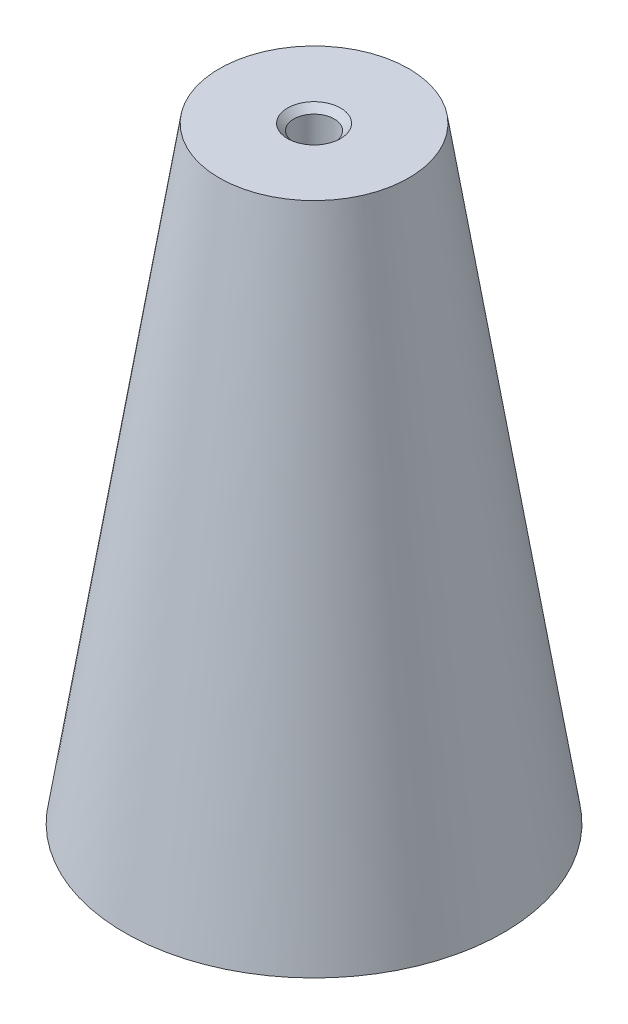
ISO-10303-21;
HEADER;
FILE_DESCRIPTION(('STEP AP214'),'2;1');
FILE_NAME('part.step','',(''),(''),'','','');
FILE_SCHEMA(('AUTOMOTIVE_DESIGN { 1 0 10303 214 1 1 1 1 }'));
ENDSEC;
DATA;
#1=APPLICATION_CONTEXT('core data for automotive mechanical design processes');
#2=APPLICATION_PROTOCOL_DEFINITION('international standard','automotive_design',2000,#1);
#3=PRODUCT_CONTEXT('',#1,'mechanical');
#4=PRODUCT('Part','Part','',(#3));
#5=PRODUCT_RELATED_PRODUCT_CATEGORY('part','',(#4));
#6=PRODUCT_DEFINITION_FORMATION('','',#4);
#7=PRODUCT_DEFINITION_CONTEXT('part definition',#1,'design');
#8=PRODUCT_DEFINITION('design','',#6,#7);
#9=PRODUCT_DEFINITION_SHAPE('','',#8);
#10=(LENGTH_UNIT() NAMED_UNIT(*) SI_UNIT(.MILLI.,.METRE.));
#11=(NAMED_UNIT(*) PLANE_ANGLE_UNIT() SI_UNIT($,.RADIAN.));
#12=(NAMED_UNIT(*) SI_UNIT($,.STERADIAN.) SOLID_ANGLE_UNIT());
#13=UNCERTAINTY_MEASURE_WITH_UNIT(LENGTH_MEASURE(1.E-05),#10,'distance_accuracy_value','');
#14=(GEOMETRIC_REPRESENTATION_CONTEXT(3) GLOBAL_UNCERTAINTY_ASSIGNED_CONTEXT((#13)) GLOBAL_UNIT_ASSIGNED_CONTEXT((#10,
#11,#12)) REPRESENTATION_CONTEXT('',''));
#15=CARTESIAN_POINT('',(0.,0.,0.));
#16=DIRECTION('',(0.,0.,1.));
#17=DIRECTION('',(1.,0.,0.));
#18=AXIS2_PLACEMENT_3D('',#15,#16,#17);
#19=CARTESIAN_POINT('',(0.,0.,0.));
#20=DIRECTION('',(0.,-1.,0.));
#21=DIRECTION('',(0.,0.,-1.));
#22=AXIS2_PLACEMENT_3D('',#19,#20,#21);
#23=CONICAL_SURFACE('',#22,7.49999999999999,0.154996741923941);
#24=CARTESIAN_POINT('',(0.,-48.,0.));
#25=DIRECTION('',(0.,-1.,0.));
#26=DIRECTION('',(0.,0.,-1.));
#27=AXIS2_PLACEMENT_3D('',#24,#25,#26);
#28=CIRCLE('',#27,15.);
#29=CARTESIAN_POINT('',(0.,-48.,-15.));
#30=VERTEX_POINT('',#29);
#31=EDGE_CURVE('E65',#30,#30,#28,.T.);
#32=ORIENTED_EDGE('',*,*,#31,.F.);
#33=EDGE_LOOP('',(#32));
#34=FACE_BOUND('',#33,.T.);
#35=CARTESIAN_POINT('',(0.,0.,0.));
#36=DIRECTION('',(0.,-1.,0.));
#37=DIRECTION('',(0.,0.,-1.));
#38=AXIS2_PLACEMENT_3D('',#35,#36,#37);
#39=CIRCLE('',#38,7.49999999999999);
#40=CARTESIAN_POINT('',(0.,0.,-7.49999999999998));
#41=VERTEX_POINT('',#40);
#42=EDGE_CURVE('E56',#41,#41,#39,.T.);
#43=ORIENTED_EDGE('',*,*,#42,.T.);
#44=EDGE_LOOP('',(#43));
#45=FACE_BOUND('',#44,.T.);
#46=ADVANCED_FACE('F35',(#34,#45),#23,.T.);
#47=CARTESIAN_POINT('',(0.,0.,7.5));
#48=DIRECTION('',(0.,-1.,0.));
#49=DIRECTION('',(0.,0.,-1.));
#50=AXIS2_PLACEMENT_3D('',#47,#48,#49);
#51=PLANE('',#50);
#52=CARTESIAN_POINT('',(0.,0.,0.));
#53=DIRECTION('',(0.,-1.,0.));
#54=DIRECTION('',(0.,0.,-1.));
#55=AXIS2_PLACEMENT_3D('',#52,#53,#54);
#56=CIRCLE('',#55,2.09999999999998);
#57=CARTESIAN_POINT('',(0.,0.,-2.09999999999998));
#58=VERTEX_POINT('',#57);
#59=EDGE_CURVE('E43',#58,#58,#56,.T.);
#60=ORIENTED_EDGE('',*,*,#59,.T.);
#61=EDGE_LOOP('',(#60));
#62=FACE_BOUND('',#61,.T.);
#63=ORIENTED_EDGE('',*,*,#42,.F.);
#64=EDGE_LOOP('',(#63));
#65=FACE_BOUND('',#64,.T.);
#66=ADVANCED_FACE('F73',(#62,#65),#51,.F.);
#67=CARTESIAN_POINT('',(0.,-4.,0.));
#68=DIRECTION('',(0.,1.,0.));
#69=DIRECTION('',(0.,0.,1.));
#70=AXIS2_PLACEMENT_3D('',#67,#68,#69);
#71=PLANE('',#70);
#72=CARTESIAN_POINT('',(0.,-4.,0.));
#73=DIRECTION('',(0.,1.,0.));
#74=DIRECTION('',(0.,0.,1.));
#75=AXIS2_PLACEMENT_3D('',#72,#73,#74);
#76=CIRCLE('',#75,2.09999999999998);
#77=CARTESIAN_POINT('',(0.,-4.,2.09999999999998));
#78=VERTEX_POINT('',#77);
#79=EDGE_CURVE('E10',#78,#78,#76,.T.);
#80=ORIENTED_EDGE('',*,*,#79,.T.);
#81=EDGE_LOOP('',(#80));
#82=FACE_BOUND('',#81,.T.);
#83=CARTESIAN_POINT('',(0.,-4.,0.));
#84=DIRECTION('',(0.,-1.,0.));
#85=DIRECTION('',(0.,0.,-1.));
#86=AXIS2_PLACEMENT_3D('',#83,#84,#85);
#87=CIRCLE('',#86,4.12499999999999);
#88=CARTESIAN_POINT('',(0.,-4.,-4.12499999999998));
#89=VERTEX_POINT('',#88);
#90=EDGE_CURVE('E59',#89,#89,#87,.T.);
#91=ORIENTED_EDGE('',*,*,#90,.T.);
#92=EDGE_LOOP('',(#91));
#93=FACE_BOUND('',#92,.T.);
#94=ADVANCED_FACE('F78',(#82,#93),#71,.F.);
#95=CARTESIAN_POINT('',(0.,-48.,0.));
#96=DIRECTION('',(0.,-1.,0.));
#97=DIRECTION('',(0.,0.,-1.));
#98=AXIS2_PLACEMENT_3D('',#95,#96,#97);
#99=CONICAL_SURFACE('',#98,11.,0.154996741923941);
#100=ORIENTED_EDGE('',*,*,#90,.F.);
#101=EDGE_LOOP('',(#100));
#102=FACE_BOUND('',#101,.T.);
#103=CARTESIAN_POINT('',(0.,-48.,0.));
#104=DIRECTION('',(0.,-1.,0.));
#105=DIRECTION('',(0.,0.,-1.));
#106=AXIS2_PLACEMENT_3D('',#103,#104,#105);
#107=CIRCLE('',#106,11.);
#108=CARTESIAN_POINT('',(0.,-48.,-11.));
#109=VERTEX_POINT('',#108);
#110=EDGE_CURVE('E62',#109,#109,#107,.T.);
#111=ORIENTED_EDGE('',*,*,#110,.T.);
#112=EDGE_LOOP('',(#111));
#113=FACE_BOUND('',#112,.T.);
#114=ADVANCED_FACE('F83',(#102,#113),#99,.F.);
#115=CARTESIAN_POINT('',(0.,-48.,11.));
#116=DIRECTION('',(0.,1.,0.));
#117=DIRECTION('',(0.,0.,1.));
#118=AXIS2_PLACEMENT_3D('',#115,#116,#117);
#119=PLANE('',#118);
#120=ORIENTED_EDGE('',*,*,#110,.F.);
#121=EDGE_LOOP('',(#120));
#122=FACE_BOUND('',#121,.T.);
#123=ORIENTED_EDGE('',*,*,#31,.T.);
#124=EDGE_LOOP('',(#123));
#125=FACE_BOUND('',#124,.T.);
#126=ADVANCED_FACE('F69',(#122,#125),#119,.F.);
#127=CARTESIAN_POINT('',(0.,-10.,0.));
#128=DIRECTION('',(0.,1.,0.));
#129=DIRECTION('',(0.,0.,1.));
#130=AXIS2_PLACEMENT_3D('',#127,#128,#129);
#131=CYLINDRICAL_SURFACE('',#130,1.6);
#132=CARTESIAN_POINT('',(0.,-0.499999999999983,0.));
#133=DIRECTION('',(0.,-1.,0.));
#134=DIRECTION('',(0.,0.,-1.));
#135=AXIS2_PLACEMENT_3D('',#132,#133,#134);
#136=CIRCLE('',#135,1.6);
#137=CARTESIAN_POINT('',(0.,-0.499999999999984,-1.6));
#138=VERTEX_POINT('',#137);
#139=EDGE_CURVE('E47',#138,#138,#136,.F.);
#140=ORIENTED_EDGE('',*,*,#139,.T.);
#141=EDGE_LOOP('',(#140));
#142=FACE_BOUND('',#141,.T.);
#143=CARTESIAN_POINT('',(0.,-3.50000000000001,0.));
#144=DIRECTION('',(0.,1.,0.));
#145=DIRECTION('',(0.,0.,1.));
#146=AXIS2_PLACEMENT_3D('',#143,#144,#145);
#147=CIRCLE('',#146,1.6);
#148=CARTESIAN_POINT('',(0.,-3.50000000000001,1.6));
#149=VERTEX_POINT('',#148);
#150=EDGE_CURVE('E51',#149,#149,#147,.F.);
#151=ORIENTED_EDGE('',*,*,#150,.T.);
#152=EDGE_LOOP('',(#151));
#153=FACE_BOUND('',#152,.T.);
#154=ADVANCED_FACE('F91',(#142,#153),#131,.F.);
#155=CARTESIAN_POINT('',(0.,-0.499999999999983,0.));
#156=DIRECTION('',(0.,1.,0.));
#157=DIRECTION('',(0.,0.,1.));
#158=AXIS2_PLACEMENT_3D('',#155,#156,#157);
#159=CONICAL_SURFACE('',#158,1.6,0.785398163397448);
#160=ORIENTED_EDGE('',*,*,#59,.F.);
#161=EDGE_LOOP('',(#160));
#162=FACE_BOUND('',#161,.T.);
#163=ORIENTED_EDGE('',*,*,#139,.F.);
#164=EDGE_LOOP('',(#163));
#165=FACE_BOUND('',#164,.T.);
#166=ADVANCED_FACE('F87',(#162,#165),#159,.F.);
#167=CARTESIAN_POINT('',(0.,-4.,0.));
#168=DIRECTION('',(0.,-1.,0.));
#169=DIRECTION('',(0.,0.,-1.));
#170=AXIS2_PLACEMENT_3D('',#167,#168,#169);
#171=CONICAL_SURFACE('',#170,2.09999999999998,0.78539816339744);
#172=ORIENTED_EDGE('',*,*,#150,.F.);
#173=EDGE_LOOP('',(#172));
#174=FACE_BOUND('',#173,.T.);
#175=ORIENTED_EDGE('',*,*,#79,.F.);
#176=EDGE_LOOP('',(#175));
#177=FACE_BOUND('',#176,.T.);
#178=ADVANCED_FACE('F38',(#174,#177),#171,.F.);
#179=CLOSED_SHELL('',(#46,#66,#94,#114,#126,#154,#166,#178));
#180=MANIFOLD_SOLID_BREP('B2',#179);
#181=ADVANCED_BREP_SHAPE_REPRESENTATION('',(#18,#180),#14);
#182=SHAPE_DEFINITION_REPRESENTATION(#9,#181);
ENDSEC;
END-ISO-10303-21;
